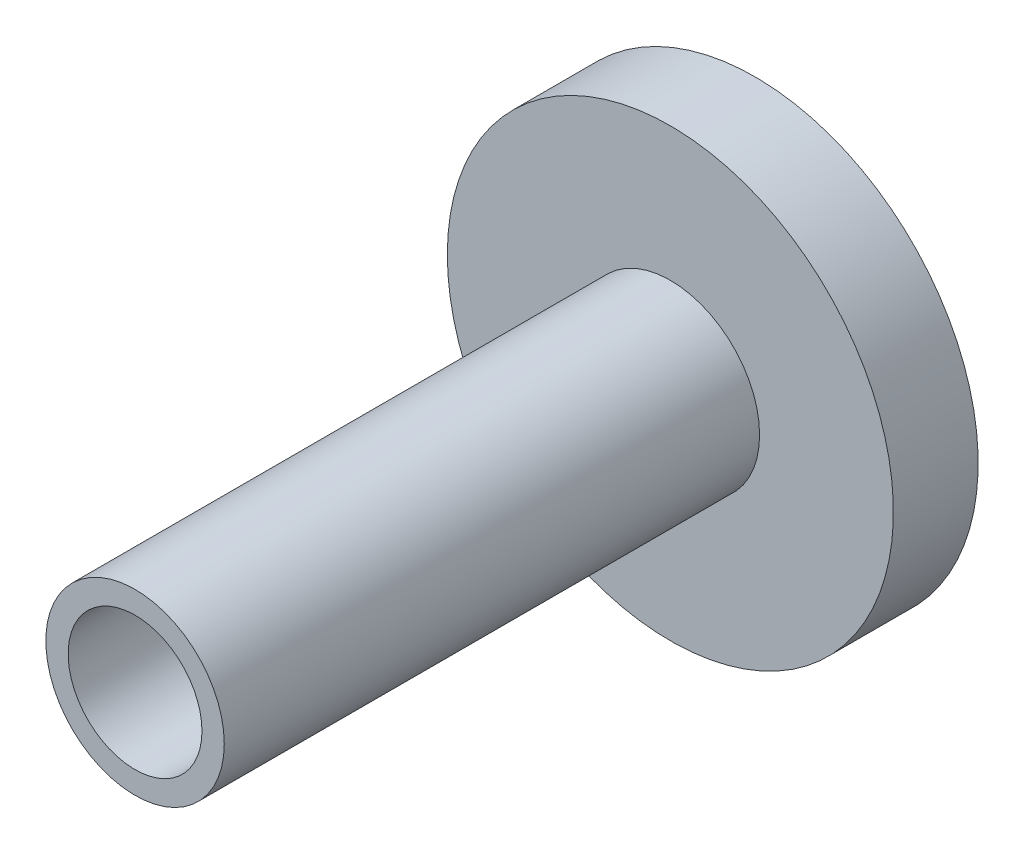
ISO-10303-21;
HEADER;
FILE_DESCRIPTION(('STEP AP214'),'2;1');
FILE_NAME('part.step','',(''),(''),'','','');
FILE_SCHEMA(('AUTOMOTIVE_DESIGN { 1 0 10303 214 1 1 1 1 }'));
ENDSEC;
DATA;
#1=APPLICATION_CONTEXT('core data for automotive mechanical design processes');
#2=APPLICATION_PROTOCOL_DEFINITION('international standard','automotive_design',2000,#1);
#3=PRODUCT_CONTEXT('',#1,'mechanical');
#4=PRODUCT('Part','Part','',(#3));
#5=PRODUCT_RELATED_PRODUCT_CATEGORY('part','',(#4));
#6=PRODUCT_DEFINITION_FORMATION('','',#4);
#7=PRODUCT_DEFINITION_CONTEXT('part definition',#1,'design');
#8=PRODUCT_DEFINITION('design','',#6,#7);
#9=PRODUCT_DEFINITION_SHAPE('','',#8);
#10=(LENGTH_UNIT() NAMED_UNIT(*) SI_UNIT(.MILLI.,.METRE.));
#11=(NAMED_UNIT(*) PLANE_ANGLE_UNIT() SI_UNIT($,.RADIAN.));
#12=(NAMED_UNIT(*) SI_UNIT($,.STERADIAN.) SOLID_ANGLE_UNIT());
#13=UNCERTAINTY_MEASURE_WITH_UNIT(LENGTH_MEASURE(1.E-05),#10,'distance_accuracy_value','');
#14=(GEOMETRIC_REPRESENTATION_CONTEXT(3) GLOBAL_UNCERTAINTY_ASSIGNED_CONTEXT((#13)) GLOBAL_UNIT_ASSIGNED_CONTEXT((#10,
#11,#12)) REPRESENTATION_CONTEXT('',''));
#15=CARTESIAN_POINT('',(0.,0.,0.));
#16=DIRECTION('',(0.,0.,1.));
#17=DIRECTION('',(1.,0.,0.));
#18=AXIS2_PLACEMENT_3D('',#15,#16,#17);
#19=CARTESIAN_POINT('',(0.,0.,1.9));
#20=DIRECTION('',(0.,0.,-1.));
#21=DIRECTION('',(-1.,0.,0.));
#22=AXIS2_PLACEMENT_3D('',#19,#20,#21);
#23=CYLINDRICAL_SURFACE('',#22,5.);
#24=CARTESIAN_POINT('',(0.,0.,1.9));
#25=DIRECTION('',(0.,0.,1.));
#26=DIRECTION('',(1.,0.,0.));
#27=AXIS2_PLACEMENT_3D('',#24,#25,#26);
#28=CIRCLE('',#27,5.);
#29=CARTESIAN_POINT('',(-5.,0.,1.9));
#30=VERTEX_POINT('',#29);
#31=EDGE_CURVE('E10',#30,#30,#28,.T.);
#32=CARTESIAN_POINT('',(0.,0.,0.));
#33=DIRECTION('',(0.,0.,1.));
#34=DIRECTION('',(1.,0.,0.));
#35=AXIS2_PLACEMENT_3D('',#32,#33,#34);
#36=CIRCLE('',#35,5.);
#37=CARTESIAN_POINT('',(-5.,0.,0.));
#38=VERTEX_POINT('',#37);
#39=EDGE_CURVE('E38',#38,#38,#36,.T.);
#40=CARTESIAN_POINT('',(-5.,0.,1.9));
#41=CARTESIAN_POINT('',(-5.,0.,1.88020833333333));
#42=CARTESIAN_POINT('',(-5.,0.,1.86041666666667));
#43=CARTESIAN_POINT('',(-5.,0.,1.82083333333333));
#44=CARTESIAN_POINT('',(-5.,0.,1.80104166666667));
#45=CARTESIAN_POINT('',(-5.,0.,1.76145833333333));
#46=CARTESIAN_POINT('',(-5.,0.,1.74166666666667));
#47=CARTESIAN_POINT('',(-5.,0.,1.70208333333333));
#48=CARTESIAN_POINT('',(-5.,0.,1.68229166666667));
#49=CARTESIAN_POINT('',(-5.,0.,1.64270833333333));
#50=CARTESIAN_POINT('',(-5.,0.,1.62291666666667));
#51=CARTESIAN_POINT('',(-5.,0.,1.58333333333333));
#52=CARTESIAN_POINT('',(-5.,0.,1.56354166666667));
#53=CARTESIAN_POINT('',(-5.,0.,1.52395833333333));
#54=CARTESIAN_POINT('',(-5.,0.,1.50416666666667));
#55=CARTESIAN_POINT('',(-5.,0.,1.46458333333333));
#56=CARTESIAN_POINT('',(-5.,0.,1.44479166666667));
#57=CARTESIAN_POINT('',(-5.,0.,1.40520833333333));
#58=CARTESIAN_POINT('',(-5.,0.,1.38541666666667));
#59=CARTESIAN_POINT('',(-5.,0.,1.34583333333333));
#60=CARTESIAN_POINT('',(-5.,0.,1.32604166666667));
#61=CARTESIAN_POINT('',(-5.,0.,1.28645833333333));
#62=CARTESIAN_POINT('',(-5.,0.,1.26666666666667));
#63=CARTESIAN_POINT('',(-5.,0.,1.22708333333333));
#64=CARTESIAN_POINT('',(-5.,0.,1.20729166666667));
#65=CARTESIAN_POINT('',(-5.,0.,1.16770833333333));
#66=CARTESIAN_POINT('',(-5.,0.,1.14791666666667));
#67=CARTESIAN_POINT('',(-5.,0.,1.10833333333333));
#68=CARTESIAN_POINT('',(-5.,0.,1.08854166666667));
#69=CARTESIAN_POINT('',(-5.,0.,1.04895833333333));
#70=CARTESIAN_POINT('',(-5.,0.,1.02916666666667));
#71=CARTESIAN_POINT('',(-5.,0.,0.989583333333333));
#72=CARTESIAN_POINT('',(-5.,0.,0.969791666666666));
#73=CARTESIAN_POINT('',(-5.,0.,0.930208333333333));
#74=CARTESIAN_POINT('',(-5.,0.,0.910416666666667));
#75=CARTESIAN_POINT('',(-5.,0.,0.870833333333333));
#76=CARTESIAN_POINT('',(-5.,0.,0.851041666666667));
#77=CARTESIAN_POINT('',(-5.,0.,0.811458333333333));
#78=CARTESIAN_POINT('',(-5.,0.,0.791666666666667));
#79=CARTESIAN_POINT('',(-5.,0.,0.752083333333333));
#80=CARTESIAN_POINT('',(-5.,0.,0.732291666666667));
#81=CARTESIAN_POINT('',(-5.,0.,0.692708333333333));
#82=CARTESIAN_POINT('',(-5.,0.,0.672916666666667));
#83=CARTESIAN_POINT('',(-5.,0.,0.633333333333333));
#84=CARTESIAN_POINT('',(-5.,0.,0.613541666666667));
#85=CARTESIAN_POINT('',(-5.,0.,0.573958333333333));
#86=CARTESIAN_POINT('',(-5.,0.,0.554166666666667));
#87=CARTESIAN_POINT('',(-5.,0.,0.514583333333334));
#88=CARTESIAN_POINT('',(-5.,0.,0.494791666666667));
#89=CARTESIAN_POINT('',(-5.,0.,0.455208333333333));
#90=CARTESIAN_POINT('',(-5.,0.,0.435416666666667));
#91=CARTESIAN_POINT('',(-5.,0.,0.395833333333333));
#92=CARTESIAN_POINT('',(-5.,0.,0.376041666666667));
#93=CARTESIAN_POINT('',(-5.,0.,0.336458333333333));
#94=CARTESIAN_POINT('',(-5.,0.,0.316666666666667));
#95=CARTESIAN_POINT('',(-5.,0.,0.277083333333333));
#96=CARTESIAN_POINT('',(-5.,0.,0.257291666666667));
#97=CARTESIAN_POINT('',(-5.,0.,0.217708333333333));
#98=CARTESIAN_POINT('',(-5.,0.,0.197916666666667));
#99=CARTESIAN_POINT('',(-5.,0.,0.158333333333333));
#100=CARTESIAN_POINT('',(-5.,0.,0.138541666666667));
#101=CARTESIAN_POINT('',(-5.,0.,0.0989583333333333));
#102=CARTESIAN_POINT('',(-5.,0.,0.0791666666666666));
#103=CARTESIAN_POINT('',(-5.,0.,0.0395833333333333));
#104=CARTESIAN_POINT('',(-5.,0.,0.0197916666666666));
#105=CARTESIAN_POINT('',(-5.,0.,0.));
#106=B_SPLINE_CURVE_WITH_KNOTS('',3,(#40,#41,#42,#43,#44,#45,#46,#47,#48,#49,#50,#51,#52,#53,
#54,#55,#56,#57,#58,#59,#60,#61,#62,#63,#64,#65,#66,#67,#68,#69,#70,#71,#72,#73,#74,#75,#76,#77,
#78,#79,#80,#81,#82,#83,#84,#85,#86,#87,#88,#89,#90,#91,#92,#93,#94,#95,#96,#97,#98,#99,#100,
#101,#102,#103,#104,#105),.UNSPECIFIED.,.F.,.F.,(4,2,2,2,2,2,2,2,2,2,2,2,2,2,2,2,2,2,2,2,2,2,2,
2,2,2,2,2,2,2,2,2,4),(0.,0.0593750000000002,0.11875,0.178125,0.2375,0.296875,0.35625,0.415625,
0.475,0.534375,0.59375,0.653125,0.7125,0.771875,0.83125,0.890625,0.95,1.009375,1.06875,1.128125,
1.1875,1.246875,1.30625,1.365625,1.425,1.484375,1.54375,1.603125,1.6625,1.721875,1.78125,
1.840625,1.9),.UNSPECIFIED.);
#107=EDGE_CURVE('BSEAM35',#30,#38,#106,.T.);
#108=ORIENTED_EDGE('',*,*,#31,.F.);
#109=ORIENTED_EDGE('',*,*,#39,.T.);
#110=ORIENTED_EDGE('',*,*,#107,.T.);
#111=ORIENTED_EDGE('',*,*,#107,.F.);
#112=EDGE_LOOP('',(#108,#110,#109,#111));
#113=FACE_BOUND('',#112,.T.);
#114=ADVANCED_FACE('F35',(#113),#23,.T.);
#115=CARTESIAN_POINT('',(0.,0.,1.9));
#116=DIRECTION('',(0.,0.,1.));
#117=DIRECTION('',(1.,0.,0.));
#118=AXIS2_PLACEMENT_3D('',#115,#116,#117);
#119=PLANE('',#118);
#120=CARTESIAN_POINT('',(0.,0.,1.9));
#121=DIRECTION('',(0.,0.,1.));
#122=DIRECTION('',(1.,0.,0.));
#123=AXIS2_PLACEMENT_3D('',#120,#121,#122);
#124=CIRCLE('',#123,2.);
#125=CARTESIAN_POINT('',(2.,0.,1.9));
#126=VERTEX_POINT('',#125);
#127=EDGE_CURVE('E47',#126,#126,#124,.T.);
#128=ORIENTED_EDGE('',*,*,#127,.F.);
#129=EDGE_LOOP('',(#128));
#130=FACE_BOUND('',#129,.T.);
#131=ORIENTED_EDGE('',*,*,#31,.T.);
#132=EDGE_LOOP('',(#131));
#133=FACE_BOUND('',#132,.T.);
#134=ADVANCED_FACE('F80',(#130,#133),#119,.T.);
#135=CARTESIAN_POINT('',(0.,0.,0.));
#136=DIRECTION('',(0.,0.,1.));
#137=DIRECTION('',(1.,0.,0.));
#138=AXIS2_PLACEMENT_3D('',#135,#136,#137);
#139=PLANE('',#138);
#140=ORIENTED_EDGE('',*,*,#39,.F.);
#141=EDGE_LOOP('',(#140));
#142=FACE_BOUND('',#141,.T.);
#143=ADVANCED_FACE('F76',(#142),#139,.F.);
#144=CARTESIAN_POINT('',(0.,0.,13.9));
#145=DIRECTION('',(0.,0.,-1.));
#146=DIRECTION('',(-1.,0.,0.));
#147=AXIS2_PLACEMENT_3D('',#144,#145,#146);
#148=CYLINDRICAL_SURFACE('',#147,2.);
#149=CARTESIAN_POINT('',(0.,0.,13.9));
#150=DIRECTION('',(0.,0.,1.));
#151=DIRECTION('',(1.,0.,0.));
#152=AXIS2_PLACEMENT_3D('',#149,#150,#151);
#153=CIRCLE('',#152,2.);
#154=CARTESIAN_POINT('',(2.,0.,13.9));
#155=VERTEX_POINT('',#154);
#156=EDGE_CURVE('E45',#155,#155,#153,.T.);
#157=ORIENTED_EDGE('',*,*,#156,.F.);
#158=EDGE_LOOP('',(#157));
#159=FACE_BOUND('',#158,.T.);
#160=ORIENTED_EDGE('',*,*,#127,.T.);
#161=EDGE_LOOP('',(#160));
#162=FACE_BOUND('',#161,.T.);
#163=ADVANCED_FACE('F70',(#159,#162),#148,.T.);
#164=CARTESIAN_POINT('',(0.,0.,13.9));
#165=DIRECTION('',(0.,0.,1.));
#166=DIRECTION('',(1.,0.,0.));
#167=AXIS2_PLACEMENT_3D('',#164,#165,#166);
#168=PLANE('',#167);
#169=CARTESIAN_POINT('',(0.,0.,13.9));
#170=DIRECTION('',(0.,0.,1.));
#171=DIRECTION('',(1.,0.,0.));
#172=AXIS2_PLACEMENT_3D('',#169,#170,#171);
#173=CIRCLE('',#172,1.5);
#174=CARTESIAN_POINT('',(1.5,0.,13.9));
#175=VERTEX_POINT('',#174);
#176=EDGE_CURVE('E53',#175,#175,#173,.T.);
#177=ORIENTED_EDGE('',*,*,#176,.F.);
#178=EDGE_LOOP('',(#177));
#179=FACE_BOUND('',#178,.T.);
#180=ORIENTED_EDGE('',*,*,#156,.T.);
#181=EDGE_LOOP('',(#180));
#182=FACE_BOUND('',#181,.T.);
#183=ADVANCED_FACE('F64',(#179,#182),#168,.T.);
#184=CARTESIAN_POINT('',(0.,0.,1.9));
#185=DIRECTION('',(0.,0.,1.));
#186=DIRECTION('',(1.,0.,0.));
#187=AXIS2_PLACEMENT_3D('',#184,#185,#186);
#188=CYLINDRICAL_SURFACE('',#187,1.5);
#189=CARTESIAN_POINT('',(0.,0.,1.9));
#190=DIRECTION('',(0.,0.,1.));
#191=DIRECTION('',(1.,0.,0.));
#192=AXIS2_PLACEMENT_3D('',#189,#190,#191);
#193=CIRCLE('',#192,1.5);
#194=CARTESIAN_POINT('',(1.5,0.,1.9));
#195=VERTEX_POINT('',#194);
#196=EDGE_CURVE('E50',#195,#195,#193,.T.);
#197=ORIENTED_EDGE('',*,*,#196,.F.);
#198=EDGE_LOOP('',(#197));
#199=FACE_BOUND('',#198,.T.);
#200=ORIENTED_EDGE('',*,*,#176,.T.);
#201=EDGE_LOOP('',(#200));
#202=FACE_BOUND('',#201,.T.);
#203=ADVANCED_FACE('F61',(#199,#202),#188,.F.);
#204=CARTESIAN_POINT('',(0.,0.,1.9));
#205=DIRECTION('',(0.,0.,1.));
#206=DIRECTION('',(1.,0.,0.));
#207=AXIS2_PLACEMENT_3D('',#204,#205,#206);
#208=PLANE('',#207);
#209=ORIENTED_EDGE('',*,*,#196,.T.);
#210=EDGE_LOOP('',(#209));
#211=FACE_BOUND('',#210,.T.);
#212=ADVANCED_FACE('F59',(#211),#208,.T.);
#213=CLOSED_SHELL('',(#114,#134,#143,#163,#183,#203,#212));
#214=MANIFOLD_SOLID_BREP('B2',#213);
#215=ADVANCED_BREP_SHAPE_REPRESENTATION('',(#18,#214),#14);
#216=SHAPE_DEFINITION_REPRESENTATION(#9,#215);
ENDSEC;
END-ISO-10303-21;
